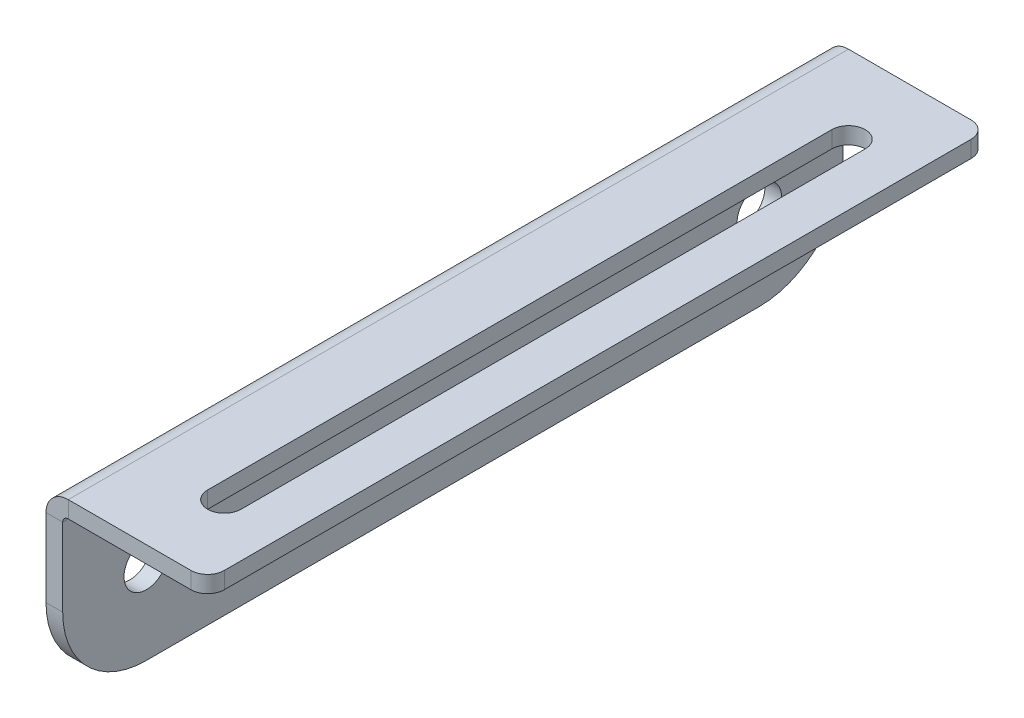
ISO-10303-21;
HEADER;
FILE_DESCRIPTION(('STEP AP214'),'2;1');
FILE_NAME('part.step','',(''),(''),'','','');
FILE_SCHEMA(('AUTOMOTIVE_DESIGN { 1 0 10303 214 1 1 1 1 }'));
ENDSEC;
DATA;
#1=APPLICATION_CONTEXT('core data for automotive mechanical design processes');
#2=APPLICATION_PROTOCOL_DEFINITION('international standard','automotive_design',2000,#1);
#3=PRODUCT_CONTEXT('',#1,'mechanical');
#4=PRODUCT('Part','Part','',(#3));
#5=PRODUCT_RELATED_PRODUCT_CATEGORY('part','',(#4));
#6=PRODUCT_DEFINITION_FORMATION('','',#4);
#7=PRODUCT_DEFINITION_CONTEXT('part definition',#1,'design');
#8=PRODUCT_DEFINITION('design','',#6,#7);
#9=PRODUCT_DEFINITION_SHAPE('','',#8);
#10=(LENGTH_UNIT() NAMED_UNIT(*) SI_UNIT(.MILLI.,.METRE.));
#11=(NAMED_UNIT(*) PLANE_ANGLE_UNIT() SI_UNIT($,.RADIAN.));
#12=(NAMED_UNIT(*) SI_UNIT($,.STERADIAN.) SOLID_ANGLE_UNIT());
#13=UNCERTAINTY_MEASURE_WITH_UNIT(LENGTH_MEASURE(1.E-05),#10,'distance_accuracy_value','');
#14=(GEOMETRIC_REPRESENTATION_CONTEXT(3) GLOBAL_UNCERTAINTY_ASSIGNED_CONTEXT((#13)) GLOBAL_UNIT_ASSIGNED_CONTEXT((#10,
#11,#12)) REPRESENTATION_CONTEXT('',''));
#15=CARTESIAN_POINT('',(0.,0.,0.));
#16=DIRECTION('',(0.,0.,1.));
#17=DIRECTION('',(1.,0.,0.));
#18=AXIS2_PLACEMENT_3D('',#15,#16,#17);
#19=CARTESIAN_POINT('',(-14.5,0.,0.));
#20=DIRECTION('',(1.,0.,0.));
#21=DIRECTION('',(0.,1.,0.));
#22=AXIS2_PLACEMENT_3D('',#19,#20,#21);
#23=PLANE('',#22);
#24=CARTESIAN_POINT('',(-14.5,-18.,-55.));
#25=DIRECTION('',(-1.,0.,0.));
#26=DIRECTION('',(0.,-1.,0.));
#27=AXIS2_PLACEMENT_3D('',#24,#25,#26);
#28=CIRCLE('',#27,4.00000000000001);
#29=CARTESIAN_POINT('',(-14.5000000000001,-22.,-55.));
#30=VERTEX_POINT('',#29);
#31=EDGE_CURVE('E647',#30,#30,#28,.T.);
#32=ORIENTED_EDGE('',*,*,#31,.F.);
#33=EDGE_LOOP('',(#32));
#34=FACE_BOUND('',#33,.T.);
#35=DIRECTION('',(0.,0.,1.));
#36=VECTOR('',#35,1.);
#37=CARTESIAN_POINT('',(-14.5000000000001,-33.,0.));
#38=LINE('',#37,#36);
#39=CARTESIAN_POINT('',(-14.5000000000001,-33.,-55.));
#40=VERTEX_POINT('',#39);
#41=CARTESIAN_POINT('',(-14.5000000000001,-33.,55.));
#42=VERTEX_POINT('',#41);
#43=EDGE_CURVE('E232',#40,#42,#38,.T.);
#44=ORIENTED_EDGE('',*,*,#43,.T.);
#45=CARTESIAN_POINT('',(-14.5,-18.,55.));
#46=DIRECTION('',(-1.,0.,0.));
#47=DIRECTION('',(0.,-1.,0.));
#48=AXIS2_PLACEMENT_3D('',#45,#46,#47);
#49=CIRCLE('',#48,15.);
#50=CARTESIAN_POINT('',(-14.5,-18.,70.));
#51=VERTEX_POINT('',#50);
#52=EDGE_CURVE('E109',#51,#42,#49,.F.);
#53=ORIENTED_EDGE('',*,*,#52,.F.);
#54=DIRECTION('',(0.,1.,0.));
#55=VECTOR('',#54,1.);
#56=CARTESIAN_POINT('',(-14.5,0.,70.));
#57=LINE('',#56,#55);
#58=CARTESIAN_POINT('',(-14.5,-3.99999999999998,70.));
#59=VERTEX_POINT('',#58);
#60=EDGE_CURVE('E221',#51,#59,#57,.T.);
#61=ORIENTED_EDGE('',*,*,#60,.T.);
#62=DIRECTION('',(0.,0.,-1.));
#63=VECTOR('',#62,1.);
#64=CARTESIAN_POINT('',(-14.5,-3.99999999999999,70.));
#65=LINE('',#64,#63);
#66=CARTESIAN_POINT('',(-14.5,-3.99999999999998,-70.));
#67=VERTEX_POINT('',#66);
#68=EDGE_CURVE('E240',#67,#59,#65,.F.);
#69=ORIENTED_EDGE('',*,*,#68,.F.);
#70=DIRECTION('',(0.,-1.,0.));
#71=VECTOR('',#70,1.);
#72=CARTESIAN_POINT('',(-14.5,0.,-70.));
#73=LINE('',#72,#71);
#74=CARTESIAN_POINT('',(-14.5,-18.,-70.));
#75=VERTEX_POINT('',#74);
#76=EDGE_CURVE('E228',#67,#75,#73,.T.);
#77=ORIENTED_EDGE('',*,*,#76,.T.);
#78=CARTESIAN_POINT('',(-14.5,-18.,-55.));
#79=DIRECTION('',(-1.,0.,0.));
#80=DIRECTION('',(0.,-1.,0.));
#81=AXIS2_PLACEMENT_3D('',#78,#79,#80);
#82=CIRCLE('',#81,15.);
#83=EDGE_CURVE('E649',#75,#40,#82,.T.);
#84=ORIENTED_EDGE('',*,*,#83,.T.);
#85=EDGE_LOOP('',(#44,#53,#61,#69,#77,#84));
#86=FACE_BOUND('',#85,.T.);
#87=CARTESIAN_POINT('',(-14.5,-18.,55.));
#88=DIRECTION('',(-1.,0.,0.));
#89=DIRECTION('',(0.,-1.,0.));
#90=AXIS2_PLACEMENT_3D('',#87,#88,#89);
#91=CIRCLE('',#90,4.00000000000001);
#92=CARTESIAN_POINT('',(-14.5000000000001,-22.,55.));
#93=VERTEX_POINT('',#92);
#94=EDGE_CURVE('E213',#93,#93,#91,.F.);
#95=ORIENTED_EDGE('',*,*,#94,.T.);
#96=EDGE_LOOP('',(#95));
#97=FACE_BOUND('',#96,.T.);
#98=ADVANCED_FACE('F92',(#34,#86,#97),#23,.F.);
#99=CARTESIAN_POINT('',(-11.5,0.,0.));
#100=DIRECTION('',(1.,0.,0.));
#101=DIRECTION('',(0.,1.,0.));
#102=AXIS2_PLACEMENT_3D('',#99,#100,#101);
#103=PLANE('',#102);
#104=CARTESIAN_POINT('',(-11.5,-18.,-55.));
#105=DIRECTION('',(1.,0.,0.));
#106=DIRECTION('',(0.,1.,0.));
#107=AXIS2_PLACEMENT_3D('',#104,#105,#106);
#108=CIRCLE('',#107,4.00000000000001);
#109=CARTESIAN_POINT('',(-11.5,-14.,-55.));
#110=VERTEX_POINT('',#109);
#111=EDGE_CURVE('E645',#110,#110,#108,.F.);
#112=ORIENTED_EDGE('',*,*,#111,.T.);
#113=EDGE_LOOP('',(#112));
#114=FACE_BOUND('',#113,.T.);
#115=CARTESIAN_POINT('',(-11.5,-18.,55.));
#116=DIRECTION('',(1.,0.,0.));
#117=DIRECTION('',(0.,1.,0.));
#118=AXIS2_PLACEMENT_3D('',#115,#116,#117);
#119=CIRCLE('',#118,15.);
#120=CARTESIAN_POINT('',(-11.5,-18.,70.));
#121=VERTEX_POINT('',#120);
#122=CARTESIAN_POINT('',(-11.5000000000001,-33.,55.));
#123=VERTEX_POINT('',#122);
#124=EDGE_CURVE('E204',#121,#123,#119,.T.);
#125=ORIENTED_EDGE('',*,*,#124,.T.);
#126=DIRECTION('',(0.,0.,-1.));
#127=VECTOR('',#126,1.);
#128=CARTESIAN_POINT('',(-11.5000000000001,-33.,70.));
#129=LINE('',#128,#127);
#130=CARTESIAN_POINT('',(-11.5000000000001,-33.,-55.));
#131=VERTEX_POINT('',#130);
#132=EDGE_CURVE('E229',#131,#123,#129,.F.);
#133=ORIENTED_EDGE('',*,*,#132,.F.);
#134=CARTESIAN_POINT('',(-11.5,-18.,-55.));
#135=DIRECTION('',(1.,0.,0.));
#136=DIRECTION('',(0.,1.,0.));
#137=AXIS2_PLACEMENT_3D('',#134,#135,#136);
#138=CIRCLE('',#137,15.);
#139=CARTESIAN_POINT('',(-11.5,-18.,-70.));
#140=VERTEX_POINT('',#139);
#141=EDGE_CURVE('E117',#140,#131,#138,.F.);
#142=ORIENTED_EDGE('',*,*,#141,.F.);
#143=DIRECTION('',(0.,1.,0.));
#144=VECTOR('',#143,1.);
#145=CARTESIAN_POINT('',(-11.5000000000001,-33.,-70.));
#146=LINE('',#145,#144);
#147=CARTESIAN_POINT('',(-11.5,-3.99999999999999,-70.));
#148=VERTEX_POINT('',#147);
#149=EDGE_CURVE('E234',#148,#140,#146,.F.);
#150=ORIENTED_EDGE('',*,*,#149,.F.);
#151=DIRECTION('',(0.,0.,-1.));
#152=VECTOR('',#151,1.);
#153=CARTESIAN_POINT('',(-11.5,-4.,70.));
#154=LINE('',#153,#152);
#155=CARTESIAN_POINT('',(-11.5,-3.99999999999999,70.));
#156=VERTEX_POINT('',#155);
#157=EDGE_CURVE('E227',#156,#148,#154,.T.);
#158=ORIENTED_EDGE('',*,*,#157,.F.);
#159=DIRECTION('',(0.,-1.,0.));
#160=VECTOR('',#159,1.);
#161=CARTESIAN_POINT('',(-11.5,-3.,70.));
#162=LINE('',#161,#160);
#163=EDGE_CURVE('E219',#121,#156,#162,.F.);
#164=ORIENTED_EDGE('',*,*,#163,.F.);
#165=EDGE_LOOP('',(#125,#133,#142,#150,#158,#164));
#166=FACE_BOUND('',#165,.T.);
#167=CARTESIAN_POINT('',(-11.5,-18.,55.));
#168=DIRECTION('',(1.,0.,0.));
#169=DIRECTION('',(0.,1.,0.));
#170=AXIS2_PLACEMENT_3D('',#167,#168,#169);
#171=CIRCLE('',#170,4.00000000000001);
#172=CARTESIAN_POINT('',(-11.5,-14.,55.));
#173=VERTEX_POINT('',#172);
#174=EDGE_CURVE('E651',#173,#173,#171,.T.);
#175=ORIENTED_EDGE('',*,*,#174,.F.);
#176=EDGE_LOOP('',(#175));
#177=FACE_BOUND('',#176,.T.);
#178=ADVANCED_FACE('F224',(#114,#166,#177),#103,.T.);
#179=CARTESIAN_POINT('',(-14.5000000000001,-33.,70.));
#180=DIRECTION('',(0.,1.,0.));
#181=DIRECTION('',(-1.,0.,0.));
#182=AXIS2_PLACEMENT_3D('',#179,#180,#181);
#183=PLANE('',#182);
#184=DIRECTION('',(-1.,0.,0.));
#185=VECTOR('',#184,1.);
#186=CARTESIAN_POINT('',(14.501,-33.0000000000001,55.));
#187=LINE('',#186,#185);
#188=EDGE_CURVE('E208',#123,#42,#187,.T.);
#189=ORIENTED_EDGE('',*,*,#188,.T.);
#190=ORIENTED_EDGE('',*,*,#43,.F.);
#191=DIRECTION('',(-1.,0.,0.));
#192=VECTOR('',#191,1.);
#193=CARTESIAN_POINT('',(14.501,-33.0000000000001,-55.));
#194=LINE('',#193,#192);
#195=EDGE_CURVE('E249',#131,#40,#194,.T.);
#196=ORIENTED_EDGE('',*,*,#195,.F.);
#197=ORIENTED_EDGE('',*,*,#132,.T.);
#198=EDGE_LOOP('',(#189,#190,#196,#197));
#199=FACE_BOUND('',#198,.T.);
#200=ADVANCED_FACE('F386',(#199),#183,.F.);
#201=CARTESIAN_POINT('',(-14.5,-3.,-70.));
#202=DIRECTION('',(0.,0.,-1.));
#203=DIRECTION('',(-1.,0.,0.));
#204=AXIS2_PLACEMENT_3D('',#201,#202,#203);
#205=PLANE('',#204);
#206=DIRECTION('',(-1.,0.,0.));
#207=VECTOR('',#206,1.);
#208=CARTESIAN_POINT('',(-14.5,-3.,-70.));
#209=LINE('',#208,#207);
#210=CARTESIAN_POINT('',(11.5,-3.,-70.));
#211=VERTEX_POINT('',#210);
#212=CARTESIAN_POINT('',(-10.5,-3.,-70.));
#213=VERTEX_POINT('',#212);
#214=EDGE_CURVE('E318',#211,#213,#209,.T.);
#215=ORIENTED_EDGE('',*,*,#214,.T.);
#216=DIRECTION('',(0.,1.,0.));
#217=VECTOR('',#216,1.);
#218=CARTESIAN_POINT('',(-10.5,-3.,-70.));
#219=LINE('',#218,#217);
#220=CARTESIAN_POINT('',(-10.5,0.,-70.));
#221=VERTEX_POINT('',#220);
#222=EDGE_CURVE('E257',#213,#221,#219,.T.);
#223=ORIENTED_EDGE('',*,*,#222,.T.);
#224=DIRECTION('',(-1.,0.,0.));
#225=VECTOR('',#224,1.);
#226=CARTESIAN_POINT('',(-14.5,0.,-70.));
#227=LINE('',#226,#225);
#228=CARTESIAN_POINT('',(11.5,0.,-70.));
#229=VERTEX_POINT('',#228);
#230=EDGE_CURVE('E309',#229,#221,#227,.T.);
#231=ORIENTED_EDGE('',*,*,#230,.F.);
#232=DIRECTION('',(0.,1.,0.));
#233=VECTOR('',#232,1.);
#234=CARTESIAN_POINT('',(11.5,-3.,-70.));
#235=LINE('',#234,#233);
#236=EDGE_CURVE('E15',#211,#229,#235,.T.);
#237=ORIENTED_EDGE('',*,*,#236,.F.);
#238=EDGE_LOOP('',(#215,#223,#231,#237));
#239=FACE_BOUND('',#238,.T.);
#240=ADVANCED_FACE('F356',(#239),#205,.T.);
#241=CARTESIAN_POINT('',(11.5,-3.,67.));
#242=DIRECTION('',(0.,1.,0.));
#243=DIRECTION('',(0.,0.,1.));
#244=AXIS2_PLACEMENT_3D('',#241,#242,#243);
#245=PLANE('',#244);
#246=DIRECTION('',(0.,0.,-1.));
#247=VECTOR('',#246,1.);
#248=CARTESIAN_POINT('',(6.50000000000003,-3.,-56.));
#249=LINE('',#248,#247);
#250=CARTESIAN_POINT('',(6.50000000000003,-3.,56.));
#251=VERTEX_POINT('',#250);
#252=CARTESIAN_POINT('',(6.50000000000003,-3.,-56.));
#253=VERTEX_POINT('',#252);
#254=EDGE_CURVE('E284',#251,#253,#249,.T.);
#255=ORIENTED_EDGE('',*,*,#254,.T.);
#256=CARTESIAN_POINT('',(3.50000000000003,-3.,-56.));
#257=DIRECTION('',(0.,1.,0.));
#258=DIRECTION('',(0.,0.,1.));
#259=AXIS2_PLACEMENT_3D('',#256,#257,#258);
#260=CIRCLE('',#259,3.);
#261=CARTESIAN_POINT('',(0.500000000000027,-3.,-56.));
#262=VERTEX_POINT('',#261);
#263=EDGE_CURVE('E274',#253,#262,#260,.T.);
#264=ORIENTED_EDGE('',*,*,#263,.T.);
#265=DIRECTION('',(0.,0.,1.));
#266=VECTOR('',#265,1.);
#267=CARTESIAN_POINT('',(0.500000000000027,-3.,-56.));
#268=LINE('',#267,#266);
#269=CARTESIAN_POINT('',(0.500000000000026,-3.,56.));
#270=VERTEX_POINT('',#269);
#271=EDGE_CURVE('E277',#262,#270,#268,.T.);
#272=ORIENTED_EDGE('',*,*,#271,.T.);
#273=CARTESIAN_POINT('',(3.50000000000003,-3.,56.));
#274=DIRECTION('',(0.,1.,0.));
#275=DIRECTION('',(0.,0.,1.));
#276=AXIS2_PLACEMENT_3D('',#273,#274,#275);
#277=CIRCLE('',#276,3.);
#278=EDGE_CURVE('E281',#270,#251,#277,.T.);
#279=ORIENTED_EDGE('',*,*,#278,.T.);
#280=EDGE_LOOP('',(#255,#264,#272,#279));
#281=FACE_BOUND('',#280,.T.);
#282=DIRECTION('',(0.,0.,-1.));
#283=VECTOR('',#282,1.);
#284=CARTESIAN_POINT('',(-10.5,-3.,-70.));
#285=LINE('',#284,#283);
#286=CARTESIAN_POINT('',(-10.5,-3.,70.));
#287=VERTEX_POINT('',#286);
#288=EDGE_CURVE('E263',#213,#287,#285,.F.);
#289=ORIENTED_EDGE('',*,*,#288,.F.);
#290=ORIENTED_EDGE('',*,*,#214,.F.);
#291=CARTESIAN_POINT('',(11.5,-3.,-67.));
#292=DIRECTION('',(0.,1.,0.));
#293=DIRECTION('',(0.,0.,-1.));
#294=AXIS2_PLACEMENT_3D('',#291,#292,#293);
#295=CIRCLE('',#294,3.);
#296=CARTESIAN_POINT('',(14.5,-3.,-67.));
#297=VERTEX_POINT('',#296);
#298=EDGE_CURVE('E315',#297,#211,#295,.T.);
#299=ORIENTED_EDGE('',*,*,#298,.F.);
#300=DIRECTION('',(0.,0.,-1.));
#301=VECTOR('',#300,1.);
#302=CARTESIAN_POINT('',(14.5,-3.,-67.));
#303=LINE('',#302,#301);
#304=CARTESIAN_POINT('',(14.5,-3.,67.));
#305=VERTEX_POINT('',#304);
#306=EDGE_CURVE('E312',#305,#297,#303,.T.);
#307=ORIENTED_EDGE('',*,*,#306,.F.);
#308=CARTESIAN_POINT('',(11.5,-3.,67.));
#309=DIRECTION('',(0.,1.,0.));
#310=DIRECTION('',(0.,0.,1.));
#311=AXIS2_PLACEMENT_3D('',#308,#309,#310);
#312=CIRCLE('',#311,3.);
#313=CARTESIAN_POINT('',(11.5,-3.,70.));
#314=VERTEX_POINT('',#313);
#315=EDGE_CURVE('E308',#314,#305,#312,.T.);
#316=ORIENTED_EDGE('',*,*,#315,.F.);
#317=DIRECTION('',(1.,0.,0.));
#318=VECTOR('',#317,1.);
#319=CARTESIAN_POINT('',(-14.5,-3.,70.));
#320=LINE('',#319,#318);
#321=EDGE_CURVE('E306',#287,#314,#320,.T.);
#322=ORIENTED_EDGE('',*,*,#321,.F.);
#323=EDGE_LOOP('',(#289,#290,#299,#307,#316,#322));
#324=FACE_BOUND('',#323,.T.);
#325=ADVANCED_FACE('F361',(#281,#324),#245,.F.);
#326=CARTESIAN_POINT('',(11.5,0.,67.));
#327=DIRECTION('',(0.,1.,0.));
#328=DIRECTION('',(0.,0.,1.));
#329=AXIS2_PLACEMENT_3D('',#326,#327,#328);
#330=PLANE('',#329);
#331=CARTESIAN_POINT('',(3.50000000000003,0.,-56.));
#332=DIRECTION('',(0.,1.,0.));
#333=DIRECTION('',(0.,0.,1.));
#334=AXIS2_PLACEMENT_3D('',#331,#332,#333);
#335=CIRCLE('',#334,3.);
#336=CARTESIAN_POINT('',(6.50000000000003,0.,-56.));
#337=VERTEX_POINT('',#336);
#338=CARTESIAN_POINT('',(0.500000000000026,0.,-56.));
#339=VERTEX_POINT('',#338);
#340=EDGE_CURVE('E271',#337,#339,#335,.T.);
#341=ORIENTED_EDGE('',*,*,#340,.F.);
#342=DIRECTION('',(0.,0.,-1.));
#343=VECTOR('',#342,1.);
#344=CARTESIAN_POINT('',(6.50000000000003,0.,-56.));
#345=LINE('',#344,#343);
#346=CARTESIAN_POINT('',(6.50000000000003,0.,56.));
#347=VERTEX_POINT('',#346);
#348=EDGE_CURVE('E278',#347,#337,#345,.T.);
#349=ORIENTED_EDGE('',*,*,#348,.F.);
#350=CARTESIAN_POINT('',(3.50000000000003,0.,56.));
#351=DIRECTION('',(0.,1.,0.));
#352=DIRECTION('',(0.,0.,1.));
#353=AXIS2_PLACEMENT_3D('',#350,#351,#352);
#354=CIRCLE('',#353,3.);
#355=CARTESIAN_POINT('',(0.500000000000027,0.,56.));
#356=VERTEX_POINT('',#355);
#357=EDGE_CURVE('E292',#356,#347,#354,.T.);
#358=ORIENTED_EDGE('',*,*,#357,.F.);
#359=DIRECTION('',(0.,0.,1.));
#360=VECTOR('',#359,1.);
#361=CARTESIAN_POINT('',(0.500000000000027,0.,-56.));
#362=LINE('',#361,#360);
#363=EDGE_CURVE('E289',#339,#356,#362,.T.);
#364=ORIENTED_EDGE('',*,*,#363,.F.);
#365=EDGE_LOOP('',(#341,#349,#358,#364));
#366=FACE_BOUND('',#365,.T.);
#367=ORIENTED_EDGE('',*,*,#230,.T.);
#368=DIRECTION('',(0.,0.,-1.));
#369=VECTOR('',#368,1.);
#370=CARTESIAN_POINT('',(-10.5,0.,-70.));
#371=LINE('',#370,#369);
#372=CARTESIAN_POINT('',(-10.5,0.,70.));
#373=VERTEX_POINT('',#372);
#374=EDGE_CURVE('E250',#221,#373,#371,.F.);
#375=ORIENTED_EDGE('',*,*,#374,.T.);
#376=DIRECTION('',(1.,0.,0.));
#377=VECTOR('',#376,1.);
#378=CARTESIAN_POINT('',(-14.5,0.,70.));
#379=LINE('',#378,#377);
#380=CARTESIAN_POINT('',(11.5,0.,70.));
#381=VERTEX_POINT('',#380);
#382=EDGE_CURVE('E299',#373,#381,#379,.T.);
#383=ORIENTED_EDGE('',*,*,#382,.T.);
#384=CARTESIAN_POINT('',(11.5,0.,67.));
#385=DIRECTION('',(0.,1.,0.));
#386=DIRECTION('',(0.,0.,1.));
#387=AXIS2_PLACEMENT_3D('',#384,#385,#386);
#388=CIRCLE('',#387,3.);
#389=CARTESIAN_POINT('',(14.5,0.,67.));
#390=VERTEX_POINT('',#389);
#391=EDGE_CURVE('E322',#381,#390,#388,.T.);
#392=ORIENTED_EDGE('',*,*,#391,.T.);
#393=DIRECTION('',(0.,0.,-1.));
#394=VECTOR('',#393,1.);
#395=CARTESIAN_POINT('',(14.5,0.,-67.));
#396=LINE('',#395,#394);
#397=CARTESIAN_POINT('',(14.5,0.,-67.));
#398=VERTEX_POINT('',#397);
#399=EDGE_CURVE('E325',#390,#398,#396,.T.);
#400=ORIENTED_EDGE('',*,*,#399,.T.);
#401=CARTESIAN_POINT('',(11.5,0.,-67.));
#402=DIRECTION('',(0.,1.,0.));
#403=DIRECTION('',(0.,0.,-1.));
#404=AXIS2_PLACEMENT_3D('',#401,#402,#403);
#405=CIRCLE('',#404,3.);
#406=EDGE_CURVE('E328',#398,#229,#405,.T.);
#407=ORIENTED_EDGE('',*,*,#406,.T.);
#408=EDGE_LOOP('',(#367,#375,#383,#392,#400,#407));
#409=FACE_BOUND('',#408,.T.);
#410=ADVANCED_FACE('F346',(#366,#409),#330,.T.);
#411=CARTESIAN_POINT('',(11.5,-3.,-67.));
#412=DIRECTION('',(0.,1.,0.));
#413=DIRECTION('',(0.,0.,1.));
#414=AXIS2_PLACEMENT_3D('',#411,#412,#413);
#415=CYLINDRICAL_SURFACE('',#414,3.);
#416=ORIENTED_EDGE('',*,*,#406,.F.);
#417=DIRECTION('',(0.,1.,0.));
#418=VECTOR('',#417,1.);
#419=CARTESIAN_POINT('',(14.5,-3.,-67.));
#420=LINE('',#419,#418);
#421=EDGE_CURVE('E101',#297,#398,#420,.T.);
#422=ORIENTED_EDGE('',*,*,#421,.F.);
#423=ORIENTED_EDGE('',*,*,#298,.T.);
#424=ORIENTED_EDGE('',*,*,#236,.T.);
#425=EDGE_LOOP('',(#416,#422,#423,#424));
#426=FACE_BOUND('',#425,.T.);
#427=ADVANCED_FACE('F537',(#426),#415,.T.);
#428=CARTESIAN_POINT('',(14.5,-3.,-67.));
#429=DIRECTION('',(1.,0.,0.));
#430=DIRECTION('',(0.,0.,-1.));
#431=AXIS2_PLACEMENT_3D('',#428,#429,#430);
#432=PLANE('',#431);
#433=ORIENTED_EDGE('',*,*,#399,.F.);
#434=DIRECTION('',(0.,1.,0.));
#435=VECTOR('',#434,1.);
#436=CARTESIAN_POINT('',(14.5,-3.,67.));
#437=LINE('',#436,#435);
#438=EDGE_CURVE('E333',#305,#390,#437,.T.);
#439=ORIENTED_EDGE('',*,*,#438,.F.);
#440=ORIENTED_EDGE('',*,*,#306,.T.);
#441=ORIENTED_EDGE('',*,*,#421,.T.);
#442=EDGE_LOOP('',(#433,#439,#440,#441));
#443=FACE_BOUND('',#442,.T.);
#444=ADVANCED_FACE('F594',(#443),#432,.T.);
#445=CARTESIAN_POINT('',(11.5,-3.,67.));
#446=DIRECTION('',(0.,1.,0.));
#447=DIRECTION('',(0.,0.,1.));
#448=AXIS2_PLACEMENT_3D('',#445,#446,#447);
#449=CYLINDRICAL_SURFACE('',#448,3.);
#450=ORIENTED_EDGE('',*,*,#391,.F.);
#451=DIRECTION('',(0.,1.,0.));
#452=VECTOR('',#451,1.);
#453=CARTESIAN_POINT('',(11.5,-3.,70.));
#454=LINE('',#453,#452);
#455=EDGE_CURVE('E96',#314,#381,#454,.T.);
#456=ORIENTED_EDGE('',*,*,#455,.F.);
#457=ORIENTED_EDGE('',*,*,#315,.T.);
#458=ORIENTED_EDGE('',*,*,#438,.T.);
#459=EDGE_LOOP('',(#450,#456,#457,#458));
#460=FACE_BOUND('',#459,.T.);
#461=ADVANCED_FACE('F344',(#460),#449,.T.);
#462=CARTESIAN_POINT('',(-14.5,-3.,70.));
#463=DIRECTION('',(0.,0.,1.));
#464=DIRECTION('',(1.,0.,0.));
#465=AXIS2_PLACEMENT_3D('',#462,#463,#464);
#466=PLANE('',#465);
#467=DIRECTION('',(0.,1.,0.));
#468=VECTOR('',#467,1.);
#469=CARTESIAN_POINT('',(-10.5,-3.,70.));
#470=LINE('',#469,#468);
#471=EDGE_CURVE('E268',#287,#373,#470,.T.);
#472=ORIENTED_EDGE('',*,*,#471,.F.);
#473=ORIENTED_EDGE('',*,*,#321,.T.);
#474=ORIENTED_EDGE('',*,*,#455,.T.);
#475=ORIENTED_EDGE('',*,*,#382,.F.);
#476=EDGE_LOOP('',(#472,#473,#474,#475));
#477=FACE_BOUND('',#476,.T.);
#478=ADVANCED_FACE('F94',(#477),#466,.T.);
#479=CARTESIAN_POINT('',(3.50000000000003,-3.,-56.));
#480=DIRECTION('',(0.,1.,0.));
#481=DIRECTION('',(0.,0.,1.));
#482=AXIS2_PLACEMENT_3D('',#479,#480,#481);
#483=CYLINDRICAL_SURFACE('',#482,3.);
#484=ORIENTED_EDGE('',*,*,#340,.T.);
#485=DIRECTION('',(0.,1.,0.));
#486=VECTOR('',#485,1.);
#487=CARTESIAN_POINT('',(0.500000000000027,-3.,-56.));
#488=LINE('',#487,#486);
#489=EDGE_CURVE('E287',#262,#339,#488,.T.);
#490=ORIENTED_EDGE('',*,*,#489,.F.);
#491=ORIENTED_EDGE('',*,*,#263,.F.);
#492=DIRECTION('',(0.,1.,0.));
#493=VECTOR('',#492,1.);
#494=CARTESIAN_POINT('',(6.50000000000003,-3.,-56.));
#495=LINE('',#494,#493);
#496=EDGE_CURVE('E297',#253,#337,#495,.T.);
#497=ORIENTED_EDGE('',*,*,#496,.T.);
#498=EDGE_LOOP('',(#484,#490,#491,#497));
#499=FACE_BOUND('',#498,.T.);
#500=ADVANCED_FACE('F566',(#499),#483,.F.);
#501=CARTESIAN_POINT('',(6.50000000000003,-3.,-56.));
#502=DIRECTION('',(1.,0.,0.));
#503=DIRECTION('',(0.,0.,-1.));
#504=AXIS2_PLACEMENT_3D('',#501,#502,#503);
#505=PLANE('',#504);
#506=ORIENTED_EDGE('',*,*,#348,.T.);
#507=ORIENTED_EDGE('',*,*,#496,.F.);
#508=ORIENTED_EDGE('',*,*,#254,.F.);
#509=DIRECTION('',(0.,1.,0.));
#510=VECTOR('',#509,1.);
#511=CARTESIAN_POINT('',(6.50000000000003,-3.,56.));
#512=LINE('',#511,#510);
#513=EDGE_CURVE('E300',#251,#347,#512,.T.);
#514=ORIENTED_EDGE('',*,*,#513,.T.);
#515=EDGE_LOOP('',(#506,#507,#508,#514));
#516=FACE_BOUND('',#515,.T.);
#517=ADVANCED_FACE('F555',(#516),#505,.F.);
#518=CARTESIAN_POINT('',(3.50000000000003,-3.,56.));
#519=DIRECTION('',(0.,1.,0.));
#520=DIRECTION('',(0.,0.,1.));
#521=AXIS2_PLACEMENT_3D('',#518,#519,#520);
#522=CYLINDRICAL_SURFACE('',#521,3.);
#523=ORIENTED_EDGE('',*,*,#357,.T.);
#524=ORIENTED_EDGE('',*,*,#513,.F.);
#525=ORIENTED_EDGE('',*,*,#278,.F.);
#526=DIRECTION('',(0.,1.,0.));
#527=VECTOR('',#526,1.);
#528=CARTESIAN_POINT('',(0.500000000000027,-3.,56.));
#529=LINE('',#528,#527);
#530=EDGE_CURVE('E302',#270,#356,#529,.T.);
#531=ORIENTED_EDGE('',*,*,#530,.T.);
#532=EDGE_LOOP('',(#523,#524,#525,#531));
#533=FACE_BOUND('',#532,.T.);
#534=ADVANCED_FACE('F376',(#533),#522,.F.);
#535=CARTESIAN_POINT('',(0.500000000000027,-3.,-56.));
#536=DIRECTION('',(-1.,0.,0.));
#537=DIRECTION('',(0.,0.,1.));
#538=AXIS2_PLACEMENT_3D('',#535,#536,#537);
#539=PLANE('',#538);
#540=ORIENTED_EDGE('',*,*,#363,.T.);
#541=ORIENTED_EDGE('',*,*,#530,.F.);
#542=ORIENTED_EDGE('',*,*,#271,.F.);
#543=ORIENTED_EDGE('',*,*,#489,.T.);
#544=EDGE_LOOP('',(#540,#541,#542,#543));
#545=FACE_BOUND('',#544,.T.);
#546=ADVANCED_FACE('F369',(#545),#539,.F.);
#547=CARTESIAN_POINT('',(-10.5,-4.,70.));
#548=DIRECTION('',(0.,0.,1.));
#549=DIRECTION('',(1.,0.,0.));
#550=AXIS2_PLACEMENT_3D('',#547,#548,#549);
#551=PLANE('',#550);
#552=DIRECTION('',(1.,0.,0.));
#553=VECTOR('',#552,1.);
#554=CARTESIAN_POINT('',(-14.5,-3.99999999999999,70.));
#555=LINE('',#554,#553);
#556=EDGE_CURVE('E247',#156,#59,#555,.F.);
#557=ORIENTED_EDGE('',*,*,#556,.F.);
#558=CARTESIAN_POINT('',(-10.5,-4.,70.));
#559=DIRECTION('',(0.,0.,-1.));
#560=DIRECTION('',(-1.,0.,0.));
#561=AXIS2_PLACEMENT_3D('',#558,#559,#560);
#562=CIRCLE('',#561,1.);
#563=EDGE_CURVE('E260',#287,#156,#562,.F.);
#564=ORIENTED_EDGE('',*,*,#563,.F.);
#565=ORIENTED_EDGE('',*,*,#471,.T.);
#566=CARTESIAN_POINT('',(-10.5,-4.,70.));
#567=DIRECTION('',(0.,0.,-1.));
#568=DIRECTION('',(-1.,0.,0.));
#569=AXIS2_PLACEMENT_3D('',#566,#567,#568);
#570=CIRCLE('',#569,4.);
#571=EDGE_CURVE('E253',#373,#59,#570,.F.);
#572=ORIENTED_EDGE('',*,*,#571,.T.);
#573=EDGE_LOOP('',(#557,#564,#565,#572));
#574=FACE_BOUND('',#573,.T.);
#575=ADVANCED_FACE('F367',(#574),#551,.T.);
#576=CARTESIAN_POINT('',(-10.5,-4.,-70.));
#577=DIRECTION('',(0.,0.,1.));
#578=DIRECTION('',(1.,0.,0.));
#579=AXIS2_PLACEMENT_3D('',#576,#577,#578);
#580=PLANE('',#579);
#581=CARTESIAN_POINT('',(-10.5,-4.,-70.));
#582=DIRECTION('',(0.,0.,-1.));
#583=DIRECTION('',(-1.,0.,0.));
#584=AXIS2_PLACEMENT_3D('',#581,#582,#583);
#585=CIRCLE('',#584,1.);
#586=EDGE_CURVE('E265',#148,#213,#585,.T.);
#587=ORIENTED_EDGE('',*,*,#586,.F.);
#588=DIRECTION('',(1.,0.,0.));
#589=VECTOR('',#588,1.);
#590=CARTESIAN_POINT('',(-11.5,-3.99999999999999,-70.));
#591=LINE('',#590,#589);
#592=EDGE_CURVE('E243',#148,#67,#591,.F.);
#593=ORIENTED_EDGE('',*,*,#592,.T.);
#594=CARTESIAN_POINT('',(-10.5,-4.,-70.));
#595=DIRECTION('',(0.,0.,-1.));
#596=DIRECTION('',(-1.,0.,0.));
#597=AXIS2_PLACEMENT_3D('',#594,#595,#596);
#598=CIRCLE('',#597,4.);
#599=EDGE_CURVE('E254',#67,#221,#598,.T.);
#600=ORIENTED_EDGE('',*,*,#599,.T.);
#601=ORIENTED_EDGE('',*,*,#222,.F.);
#602=EDGE_LOOP('',(#587,#593,#600,#601));
#603=FACE_BOUND('',#602,.T.);
#604=ADVANCED_FACE('F352',(#603),#580,.F.);
#605=CARTESIAN_POINT('',(-10.5,-4.,-70.));
#606=DIRECTION('',(0.,0.,-1.));
#607=DIRECTION('',(-1.,0.,0.));
#608=AXIS2_PLACEMENT_3D('',#605,#606,#607);
#609=CYLINDRICAL_SURFACE('',#608,4.);
#610=ORIENTED_EDGE('',*,*,#374,.F.);
#611=ORIENTED_EDGE('',*,*,#599,.F.);
#612=ORIENTED_EDGE('',*,*,#68,.T.);
#613=ORIENTED_EDGE('',*,*,#571,.F.);
#614=EDGE_LOOP('',(#610,#611,#612,#613));
#615=FACE_BOUND('',#614,.T.);
#616=ADVANCED_FACE('F349',(#615),#609,.T.);
#617=CARTESIAN_POINT('',(-10.5,-4.,-70.));
#618=DIRECTION('',(0.,0.,-1.));
#619=DIRECTION('',(-1.,0.,0.));
#620=AXIS2_PLACEMENT_3D('',#617,#618,#619);
#621=CYLINDRICAL_SURFACE('',#620,1.);
#622=ORIENTED_EDGE('',*,*,#288,.T.);
#623=ORIENTED_EDGE('',*,*,#563,.T.);
#624=ORIENTED_EDGE('',*,*,#157,.T.);
#625=ORIENTED_EDGE('',*,*,#586,.T.);
#626=EDGE_LOOP('',(#622,#623,#624,#625));
#627=FACE_BOUND('',#626,.T.);
#628=ADVANCED_FACE('F365',(#627),#621,.F.);
#629=CARTESIAN_POINT('',(-14.5000000000001,-33.,-70.));
#630=DIRECTION('',(0.,0.,1.));
#631=DIRECTION('',(1.,0.,0.));
#632=AXIS2_PLACEMENT_3D('',#629,#630,#631);
#633=PLANE('',#632);
#634=ORIENTED_EDGE('',*,*,#149,.T.);
#635=DIRECTION('',(-1.,0.,0.));
#636=VECTOR('',#635,1.);
#637=CARTESIAN_POINT('',(14.5010000000001,-18.0000000000001,-70.));
#638=LINE('',#637,#636);
#639=EDGE_CURVE('E660',#140,#75,#638,.T.);
#640=ORIENTED_EDGE('',*,*,#639,.T.);
#641=ORIENTED_EDGE('',*,*,#76,.F.);
#642=ORIENTED_EDGE('',*,*,#592,.F.);
#643=EDGE_LOOP('',(#634,#640,#641,#642));
#644=FACE_BOUND('',#643,.T.);
#645=ADVANCED_FACE('F397',(#644),#633,.F.);
#646=CARTESIAN_POINT('',(-14.5,-2.99999999999999,70.));
#647=DIRECTION('',(0.,0.,-1.));
#648=DIRECTION('',(-1.,0.,0.));
#649=AXIS2_PLACEMENT_3D('',#646,#647,#648);
#650=PLANE('',#649);
#651=ORIENTED_EDGE('',*,*,#60,.F.);
#652=DIRECTION('',(-1.,0.,0.));
#653=VECTOR('',#652,1.);
#654=CARTESIAN_POINT('',(14.5010000000001,-18.0000000000001,70.));
#655=LINE('',#654,#653);
#656=EDGE_CURVE('E207',#121,#51,#655,.T.);
#657=ORIENTED_EDGE('',*,*,#656,.F.);
#658=ORIENTED_EDGE('',*,*,#163,.T.);
#659=ORIENTED_EDGE('',*,*,#556,.T.);
#660=EDGE_LOOP('',(#651,#657,#658,#659));
#661=FACE_BOUND('',#660,.T.);
#662=ADVANCED_FACE('F217',(#661),#650,.F.);
#663=CARTESIAN_POINT('',(14.5010000000001,-18.0000000000001,-55.));
#664=DIRECTION('',(-1.,0.,0.));
#665=DIRECTION('',(0.,-1.,0.));
#666=AXIS2_PLACEMENT_3D('',#663,#664,#665);
#667=CYLINDRICAL_SURFACE('',#666,15.);
#668=ORIENTED_EDGE('',*,*,#141,.T.);
#669=ORIENTED_EDGE('',*,*,#195,.T.);
#670=ORIENTED_EDGE('',*,*,#83,.F.);
#671=ORIENTED_EDGE('',*,*,#639,.F.);
#672=EDGE_LOOP('',(#668,#669,#670,#671));
#673=FACE_BOUND('',#672,.T.);
#674=ADVANCED_FACE('F392',(#673),#667,.T.);
#675=CARTESIAN_POINT('',(14.5010000000001,-18.0000000000001,55.));
#676=DIRECTION('',(-1.,0.,0.));
#677=DIRECTION('',(0.,-1.,0.));
#678=AXIS2_PLACEMENT_3D('',#675,#676,#677);
#679=CYLINDRICAL_SURFACE('',#678,15.);
#680=ORIENTED_EDGE('',*,*,#656,.T.);
#681=ORIENTED_EDGE('',*,*,#52,.T.);
#682=ORIENTED_EDGE('',*,*,#188,.F.);
#683=ORIENTED_EDGE('',*,*,#124,.F.);
#684=EDGE_LOOP('',(#680,#681,#682,#683));
#685=FACE_BOUND('',#684,.T.);
#686=ADVANCED_FACE('F206',(#685),#679,.T.);
#687=CARTESIAN_POINT('',(14.5010000000001,-18.0000000000001,55.));
#688=DIRECTION('',(-1.,0.,0.));
#689=DIRECTION('',(0.,-1.,0.));
#690=AXIS2_PLACEMENT_3D('',#687,#688,#689);
#691=CYLINDRICAL_SURFACE('',#690,4.00000000000001);
#692=ORIENTED_EDGE('',*,*,#174,.T.);
#693=EDGE_LOOP('',(#692));
#694=FACE_BOUND('',#693,.T.);
#695=ORIENTED_EDGE('',*,*,#94,.F.);
#696=EDGE_LOOP('',(#695));
#697=FACE_BOUND('',#696,.T.);
#698=ADVANCED_FACE('F430',(#694,#697),#691,.F.);
#699=CARTESIAN_POINT('',(14.5010000000001,-18.0000000000001,-55.));
#700=DIRECTION('',(-1.,0.,0.));
#701=DIRECTION('',(0.,-1.,0.));
#702=AXIS2_PLACEMENT_3D('',#699,#700,#701);
#703=CYLINDRICAL_SURFACE('',#702,4.00000000000001);
#704=ORIENTED_EDGE('',*,*,#111,.F.);
#705=EDGE_LOOP('',(#704));
#706=FACE_BOUND('',#705,.T.);
#707=ORIENTED_EDGE('',*,*,#31,.T.);
#708=EDGE_LOOP('',(#707));
#709=FACE_BOUND('',#708,.T.);
#710=ADVANCED_FACE('F437',(#706,#709),#703,.F.);
#711=CLOSED_SHELL('',(#98,#178,#200,#240,#325,#410,#427,#444,#461,#478,#500,#517,#534,#546,#575,
#604,#616,#628,#645,#662,#674,#686,#698,#710));
#712=MANIFOLD_SOLID_BREP('B2',#711);
#713=ADVANCED_BREP_SHAPE_REPRESENTATION('',(#18,#712),#14);
#714=SHAPE_DEFINITION_REPRESENTATION(#9,#713);
ENDSEC;
END-ISO-10303-21;
